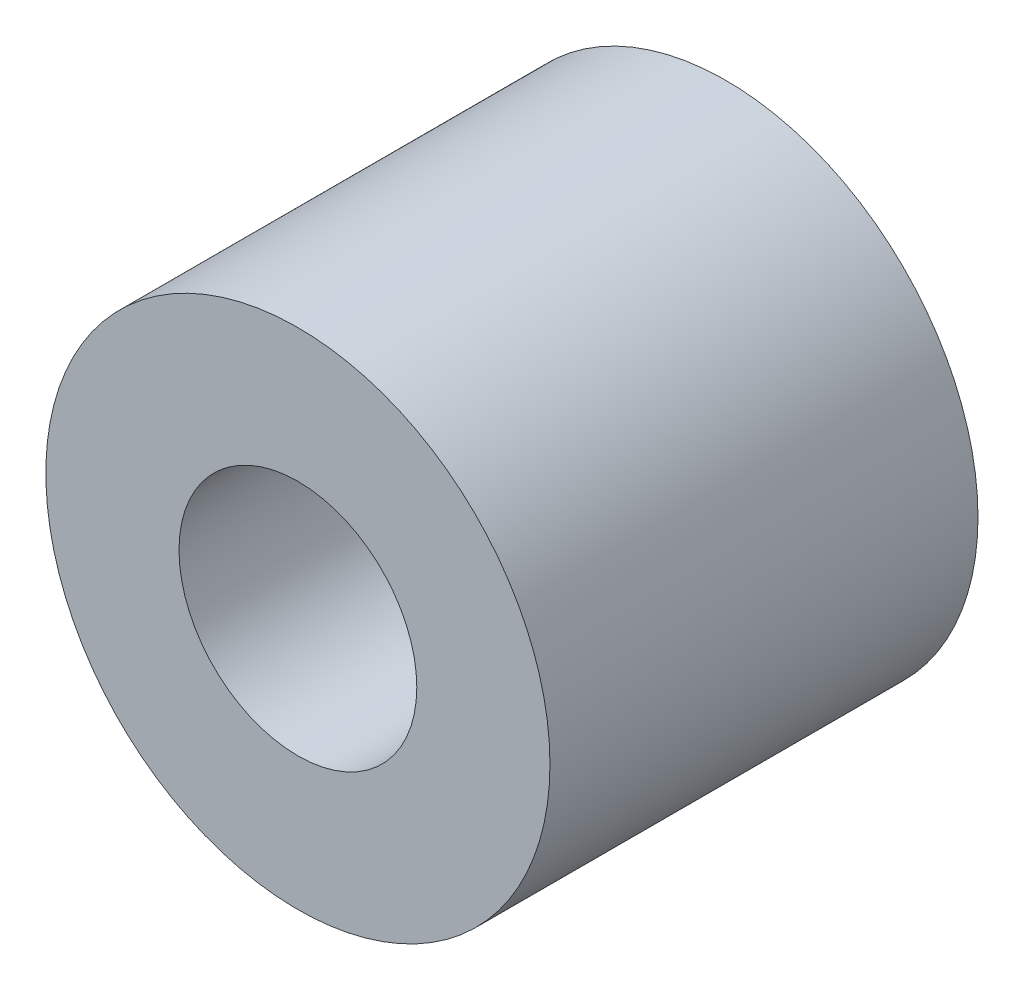
ISO-10303-21;
HEADER;
FILE_DESCRIPTION(('STEP AP214'),'2;1');
FILE_NAME('part.step','',(''),(''),'','','');
FILE_SCHEMA(('AUTOMOTIVE_DESIGN { 1 0 10303 214 1 1 1 1 }'));
ENDSEC;
DATA;
#1=APPLICATION_CONTEXT('core data for automotive mechanical design processes');
#2=APPLICATION_PROTOCOL_DEFINITION('international standard','automotive_design',2000,#1);
#3=PRODUCT_CONTEXT('',#1,'mechanical');
#4=PRODUCT('Part','Part','',(#3));
#5=PRODUCT_RELATED_PRODUCT_CATEGORY('part','',(#4));
#6=PRODUCT_DEFINITION_FORMATION('','',#4);
#7=PRODUCT_DEFINITION_CONTEXT('part definition',#1,'design');
#8=PRODUCT_DEFINITION('design','',#6,#7);
#9=PRODUCT_DEFINITION_SHAPE('','',#8);
#10=(LENGTH_UNIT() NAMED_UNIT(*) SI_UNIT(.MILLI.,.METRE.));
#11=(NAMED_UNIT(*) PLANE_ANGLE_UNIT() SI_UNIT($,.RADIAN.));
#12=(NAMED_UNIT(*) SI_UNIT($,.STERADIAN.) SOLID_ANGLE_UNIT());
#13=UNCERTAINTY_MEASURE_WITH_UNIT(LENGTH_MEASURE(1.E-05),#10,'distance_accuracy_value','');
#14=(GEOMETRIC_REPRESENTATION_CONTEXT(3) GLOBAL_UNCERTAINTY_ASSIGNED_CONTEXT((#13)) GLOBAL_UNIT_ASSIGNED_CONTEXT((#10,
#11,#12)) REPRESENTATION_CONTEXT('',''));
#15=CARTESIAN_POINT('',(0.,0.,0.));
#16=DIRECTION('',(0.,0.,1.));
#17=DIRECTION('',(1.,0.,0.));
#18=AXIS2_PLACEMENT_3D('',#15,#16,#17);
#19=CARTESIAN_POINT('',(0.,0.,450.));
#20=DIRECTION('',(0.,0.,1.));
#21=DIRECTION('',(1.,0.,0.));
#22=AXIS2_PLACEMENT_3D('',#19,#20,#21);
#23=PLANE('',#22);
#24=CARTESIAN_POINT('',(0.,0.,450.));
#25=DIRECTION('',(0.,0.,1.));
#26=DIRECTION('',(1.,0.,0.));
#27=AXIS2_PLACEMENT_3D('',#24,#25,#26);
#28=CIRCLE('',#27,265.);
#29=CARTESIAN_POINT('',(265.,0.,450.));
#30=VERTEX_POINT('',#29);
#31=EDGE_CURVE('E10',#30,#30,#28,.T.);
#32=ORIENTED_EDGE('',*,*,#31,.T.);
#33=EDGE_LOOP('',(#32));
#34=FACE_BOUND('',#33,.T.);
#35=CARTESIAN_POINT('',(0.,0.,450.));
#36=DIRECTION('',(0.,0.,1.));
#37=DIRECTION('',(1.,0.,0.));
#38=AXIS2_PLACEMENT_3D('',#35,#36,#37);
#39=CIRCLE('',#38,125.);
#40=CARTESIAN_POINT('',(125.,0.,450.));
#41=VERTEX_POINT('',#40);
#42=EDGE_CURVE('E46',#41,#41,#39,.T.);
#43=ORIENTED_EDGE('',*,*,#42,.F.);
#44=EDGE_LOOP('',(#43));
#45=FACE_BOUND('',#44,.T.);
#46=ADVANCED_FACE('F35',(#34,#45),#23,.T.);
#47=CARTESIAN_POINT('',(0.,0.,0.));
#48=DIRECTION('',(0.,0.,1.));
#49=DIRECTION('',(1.,0.,0.));
#50=AXIS2_PLACEMENT_3D('',#47,#48,#49);
#51=PLANE('',#50);
#52=CARTESIAN_POINT('',(0.,0.,0.));
#53=DIRECTION('',(0.,0.,1.));
#54=DIRECTION('',(1.,0.,0.));
#55=AXIS2_PLACEMENT_3D('',#52,#53,#54);
#56=CIRCLE('',#55,265.);
#57=CARTESIAN_POINT('',(265.,0.,0.));
#58=VERTEX_POINT('',#57);
#59=EDGE_CURVE('E39',#58,#58,#56,.T.);
#60=ORIENTED_EDGE('',*,*,#59,.F.);
#61=EDGE_LOOP('',(#60));
#62=FACE_BOUND('',#61,.T.);
#63=CARTESIAN_POINT('',(0.,0.,0.));
#64=DIRECTION('',(0.,0.,1.));
#65=DIRECTION('',(1.,0.,0.));
#66=AXIS2_PLACEMENT_3D('',#63,#64,#65);
#67=CIRCLE('',#66,125.);
#68=CARTESIAN_POINT('',(125.,0.,0.));
#69=VERTEX_POINT('',#68);
#70=EDGE_CURVE('E48',#69,#69,#67,.T.);
#71=ORIENTED_EDGE('',*,*,#70,.T.);
#72=EDGE_LOOP('',(#71));
#73=FACE_BOUND('',#72,.T.);
#74=ADVANCED_FACE('F58',(#62,#73),#51,.F.);
#75=CARTESIAN_POINT('',(0.,0.,450.));
#76=DIRECTION('',(0.,0.,-1.));
#77=DIRECTION('',(-1.,0.,0.));
#78=AXIS2_PLACEMENT_3D('',#75,#76,#77);
#79=CYLINDRICAL_SURFACE('',#78,265.);
#80=ORIENTED_EDGE('',*,*,#31,.F.);
#81=EDGE_LOOP('',(#80));
#82=FACE_BOUND('',#81,.T.);
#83=ORIENTED_EDGE('',*,*,#59,.T.);
#84=EDGE_LOOP('',(#83));
#85=FACE_BOUND('',#84,.T.);
#86=ADVANCED_FACE('F37',(#82,#85),#79,.T.);
#87=CARTESIAN_POINT('',(0.,0.,450.));
#88=DIRECTION('',(0.,0.,-1.));
#89=DIRECTION('',(-1.,0.,0.));
#90=AXIS2_PLACEMENT_3D('',#87,#88,#89);
#91=CYLINDRICAL_SURFACE('',#90,125.);
#92=ORIENTED_EDGE('',*,*,#42,.T.);
#93=EDGE_LOOP('',(#92));
#94=FACE_BOUND('',#93,.T.);
#95=ORIENTED_EDGE('',*,*,#70,.F.);
#96=EDGE_LOOP('',(#95));
#97=FACE_BOUND('',#96,.T.);
#98=ADVANCED_FACE('F54',(#94,#97),#91,.F.);
#99=CLOSED_SHELL('',(#46,#74,#86,#98));
#100=MANIFOLD_SOLID_BREP('B2',#99);
#101=ADVANCED_BREP_SHAPE_REPRESENTATION('',(#18,#100),#14);
#102=SHAPE_DEFINITION_REPRESENTATION(#9,#101);
ENDSEC;
END-ISO-10303-21;
